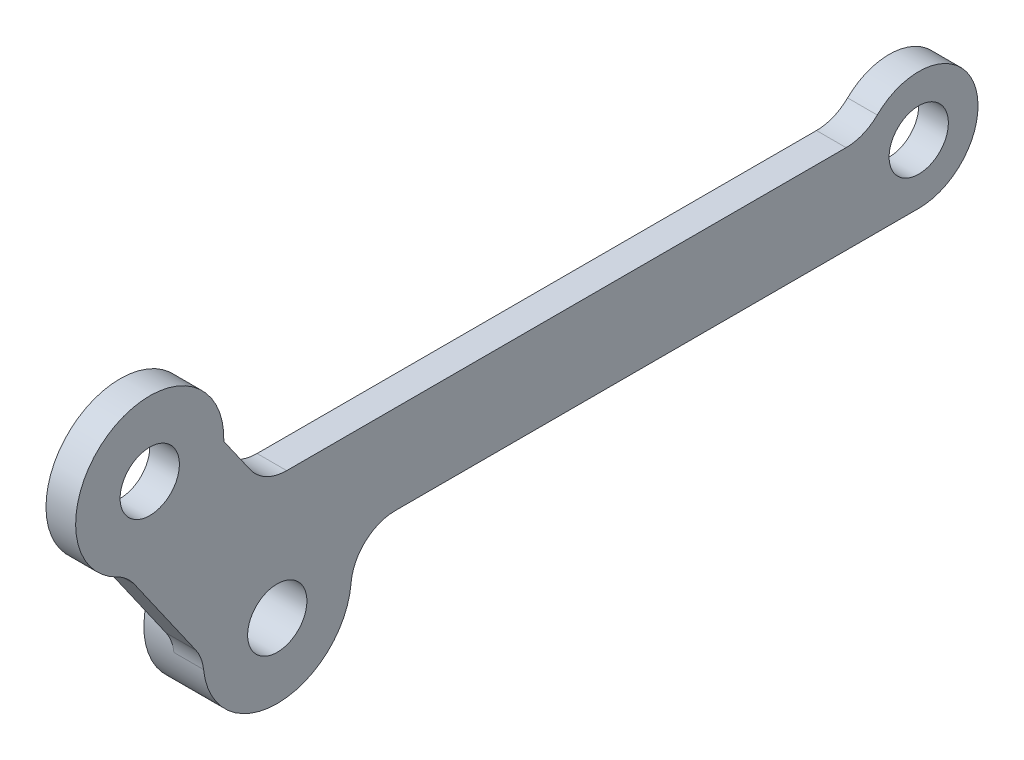
ISO-10303-21;
HEADER;
FILE_DESCRIPTION(('STEP AP214'),'2;1');
FILE_NAME('part.step','',(''),(''),'','','');
FILE_SCHEMA(('AUTOMOTIVE_DESIGN { 1 0 10303 214 1 1 1 1 }'));
ENDSEC;
DATA;
#1=APPLICATION_CONTEXT('core data for automotive mechanical design processes');
#2=APPLICATION_PROTOCOL_DEFINITION('international standard','automotive_design',2000,#1);
#3=PRODUCT_CONTEXT('',#1,'mechanical');
#4=PRODUCT('Part','Part','',(#3));
#5=PRODUCT_RELATED_PRODUCT_CATEGORY('part','',(#4));
#6=PRODUCT_DEFINITION_FORMATION('','',#4);
#7=PRODUCT_DEFINITION_CONTEXT('part definition',#1,'design');
#8=PRODUCT_DEFINITION('design','',#6,#7);
#9=PRODUCT_DEFINITION_SHAPE('','',#8);
#10=(LENGTH_UNIT() NAMED_UNIT(*) SI_UNIT(.MILLI.,.METRE.));
#11=(NAMED_UNIT(*) PLANE_ANGLE_UNIT() SI_UNIT($,.RADIAN.));
#12=(NAMED_UNIT(*) SI_UNIT($,.STERADIAN.) SOLID_ANGLE_UNIT());
#13=UNCERTAINTY_MEASURE_WITH_UNIT(LENGTH_MEASURE(1.E-05),#10,'distance_accuracy_value','');
#14=(GEOMETRIC_REPRESENTATION_CONTEXT(3) GLOBAL_UNCERTAINTY_ASSIGNED_CONTEXT((#13)) GLOBAL_UNIT_ASSIGNED_CONTEXT((#10,
#11,#12)) REPRESENTATION_CONTEXT('',''));
#15=CARTESIAN_POINT('',(0.,0.,0.));
#16=DIRECTION('',(0.,0.,1.));
#17=DIRECTION('',(1.,0.,0.));
#18=AXIS2_PLACEMENT_3D('',#15,#16,#17);
#19=CARTESIAN_POINT('',(2.,0.,0.));
#20=DIRECTION('',(0.,1.,0.));
#21=DIRECTION('',(0.,0.,1.));
#22=AXIS2_PLACEMENT_3D('',#19,#20,#21);
#23=PLANE('',#22);
#24=DIRECTION('',(0.,0.,-1.));
#25=VECTOR('',#24,1.);
#26=CARTESIAN_POINT('',(2.,0.,0.));
#27=LINE('',#26,#25);
#28=CARTESIAN_POINT('',(2.,0.,-1.56170115165524));
#29=VERTEX_POINT('',#28);
#30=CARTESIAN_POINT('',(2.,0.,-39.3022657436919));
#31=VERTEX_POINT('',#30);
#32=EDGE_CURVE('E237',#29,#31,#27,.T.);
#33=ORIENTED_EDGE('',*,*,#32,.T.);
#34=DIRECTION('',(-1.,0.,0.));
#35=VECTOR('',#34,1.);
#36=CARTESIAN_POINT('',(2.,0.,-39.3022657436919));
#37=LINE('',#36,#35);
#38=CARTESIAN_POINT('',(0.,0.,-39.3022657436919));
#39=VERTEX_POINT('',#38);
#40=EDGE_CURVE('E271',#31,#39,#37,.T.);
#41=ORIENTED_EDGE('',*,*,#40,.T.);
#42=DIRECTION('',(0.,0.,-1.));
#43=VECTOR('',#42,1.);
#44=CARTESIAN_POINT('',(0.,0.,0.));
#45=LINE('',#44,#43);
#46=CARTESIAN_POINT('',(0.,0.,-1.56170115165524));
#47=VERTEX_POINT('',#46);
#48=EDGE_CURVE('E267',#47,#39,#45,.T.);
#49=ORIENTED_EDGE('',*,*,#48,.F.);
#50=DIRECTION('',(-1.,0.,0.));
#51=VECTOR('',#50,1.);
#52=CARTESIAN_POINT('',(2.,0.,-1.56170115165524));
#53=LINE('',#52,#51);
#54=EDGE_CURVE('E247',#47,#29,#53,.F.);
#55=ORIENTED_EDGE('',*,*,#54,.T.);
#56=EDGE_LOOP('',(#33,#41,#49,#55));
#57=FACE_BOUND('',#56,.T.);
#58=ADVANCED_FACE('F134',(#57),#23,.T.);
#59=CARTESIAN_POINT('',(2.,-6.,0.));
#60=DIRECTION('',(0.,1.,0.));
#61=DIRECTION('',(0.,0.,1.));
#62=AXIS2_PLACEMENT_3D('',#59,#60,#61);
#63=PLANE('',#62);
#64=DIRECTION('',(0.,0.,-1.));
#65=VECTOR('',#64,1.);
#66=CARTESIAN_POINT('',(2.,-6.,0.));
#67=LINE('',#66,#65);
#68=CARTESIAN_POINT('',(2.,-6.,-8.89345099264765));
#69=VERTEX_POINT('',#68);
#70=CARTESIAN_POINT('',(2.,-6.,-44.2012452292583));
#71=VERTEX_POINT('',#70);
#72=EDGE_CURVE('E223',#69,#71,#67,.T.);
#73=ORIENTED_EDGE('',*,*,#72,.F.);
#74=DIRECTION('',(1.,0.,0.));
#75=VECTOR('',#74,1.);
#76=CARTESIAN_POINT('',(0.,-6.,-8.89345099264765));
#77=LINE('',#76,#75);
#78=CARTESIAN_POINT('',(0.,-6.,-8.89345099264765));
#79=VERTEX_POINT('',#78);
#80=EDGE_CURVE('E294',#69,#79,#77,.F.);
#81=ORIENTED_EDGE('',*,*,#80,.T.);
#82=DIRECTION('',(0.,0.,-1.));
#83=VECTOR('',#82,1.);
#84=CARTESIAN_POINT('',(0.,-6.,0.));
#85=LINE('',#84,#83);
#86=CARTESIAN_POINT('',(0.,-6.,-44.2012452292583));
#87=VERTEX_POINT('',#86);
#88=EDGE_CURVE('E242',#79,#87,#85,.T.);
#89=ORIENTED_EDGE('',*,*,#88,.T.);
#90=DIRECTION('',(-1.,0.,0.));
#91=VECTOR('',#90,1.);
#92=CARTESIAN_POINT('',(2.,-6.,-44.2012452292583));
#93=LINE('',#92,#91);
#94=EDGE_CURVE('E236',#71,#87,#93,.T.);
#95=ORIENTED_EDGE('',*,*,#94,.F.);
#96=EDGE_LOOP('',(#73,#81,#89,#95));
#97=FACE_BOUND('',#96,.T.);
#98=ADVANCED_FACE('F240',(#97),#63,.F.);
#99=CARTESIAN_POINT('',(0.,0.,0.));
#100=DIRECTION('',(1.,0.,0.));
#101=DIRECTION('',(0.,0.,-1.));
#102=AXIS2_PLACEMENT_3D('',#99,#100,#101);
#103=PLANE('',#102);
#104=CARTESIAN_POINT('',(0.,3.99297491893071,7.67900949316339));
#105=DIRECTION('',(1.,0.,0.));
#106=DIRECTION('',(0.,0.,-1.));
#107=AXIS2_PLACEMENT_3D('',#104,#105,#106);
#108=CIRCLE('',#107,2.);
#109=CARTESIAN_POINT('',(0.,3.99297491893071,5.67900949316339));
#110=VERTEX_POINT('',#109);
#111=EDGE_CURVE('E366',#110,#110,#108,.F.);
#112=ORIENTED_EDGE('',*,*,#111,.F.);
#113=EDGE_LOOP('',(#112));
#114=FACE_BOUND('',#113,.T.);
#115=CARTESIAN_POINT('',(0.,-2.,-44.2012452292583));
#116=DIRECTION('',(1.,0.,0.));
#117=DIRECTION('',(0.,0.,-1.));
#118=AXIS2_PLACEMENT_3D('',#115,#116,#117);
#119=CIRCLE('',#118,2.);
#120=CARTESIAN_POINT('',(0.,-2.,-46.2012452292583));
#121=VERTEX_POINT('',#120);
#122=EDGE_CURVE('E373',#121,#121,#119,.F.);
#123=ORIENTED_EDGE('',*,*,#122,.F.);
#124=EDGE_LOOP('',(#123));
#125=FACE_BOUND('',#124,.T.);
#126=ORIENTED_EDGE('',*,*,#88,.F.);
#127=CARTESIAN_POINT('',(0.,-9.,-8.89345099264765));
#128=DIRECTION('',(1.,0.,0.));
#129=DIRECTION('',(0.,0.,-1.));
#130=AXIS2_PLACEMENT_3D('',#127,#128,#129);
#131=CIRCLE('',#130,3.);
#132=CARTESIAN_POINT('',(0.,-8.73536465452657,-5.90514576494314));
#133=VERTEX_POINT('',#132);
#134=EDGE_CURVE('E318',#79,#133,#131,.T.);
#135=ORIENTED_EDGE('',*,*,#134,.T.);
#136=CARTESIAN_POINT('',(0.,-8.29430574540418,-0.924637052102279));
#137=DIRECTION('',(1.,0.,0.));
#138=DIRECTION('',(0.,0.,-1.));
#139=AXIS2_PLACEMENT_3D('',#136,#137,#138);
#140=CIRCLE('',#139,4.99999999999999);
#141=CARTESIAN_POINT('',(0.,-8.82085126347562,4.04756063276493));
#142=VERTEX_POINT('',#141);
#143=EDGE_CURVE('E363',#133,#142,#140,.T.);
#144=ORIENTED_EDGE('',*,*,#143,.T.);
#145=CARTESIAN_POINT('',(0.,-9.13677857431849,7.03087924368525));
#146=DIRECTION('',(1.,0.,0.));
#147=DIRECTION('',(0.,0.,-1.));
#148=AXIS2_PLACEMENT_3D('',#145,#146,#147);
#149=CIRCLE('',#148,3.);
#150=CARTESIAN_POINT('',(0.,-7.41604926526535,4.57342311081828));
#151=VERTEX_POINT('',#150);
#152=EDGE_CURVE('E306',#142,#151,#149,.T.);
#153=ORIENTED_EDGE('',*,*,#152,.T.);
#154=DIRECTION('',(0.,-0.819152044288993,-0.573576436351045));
#155=VECTOR('',#154,1.);
#156=CARTESIAN_POINT('',(0.,1.69866917352653,10.9556176703194));
#157=LINE('',#156,#155);
#158=CARTESIAN_POINT('',(0.,-1.47389305201649,8.73416568455478));
#159=VERTEX_POINT('',#158);
#160=EDGE_CURVE('E343',#159,#151,#157,.T.);
#161=ORIENTED_EDGE('',*,*,#160,.F.);
#162=CARTESIAN_POINT('',(0.,-3.19462236106962,11.1916218174218));
#163=DIRECTION('',(1.,0.,0.));
#164=DIRECTION('',(0.,0.,-1.));
#165=AXIS2_PLACEMENT_3D('',#162,#163,#164);
#166=CIRCLE('',#165,3.);
#167=CARTESIAN_POINT('',(0.,-0.499273381069496,9.87439219582487));
#168=VERTEX_POINT('',#167);
#169=EDGE_CURVE('E312',#159,#168,#166,.T.);
#170=ORIENTED_EDGE('',*,*,#169,.T.);
#171=CARTESIAN_POINT('',(0.,3.99297491893071,7.67900949316339));
#172=DIRECTION('',(1.,0.,0.));
#173=DIRECTION('',(0.,0.,-1.));
#174=AXIS2_PLACEMENT_3D('',#171,#172,#173);
#175=CIRCLE('',#174,4.99999999999999);
#176=CARTESIAN_POINT('',(0.,3.82982453146792,2.6816720069543));
#177=VERTEX_POINT('',#176);
#178=EDGE_CURVE('E348',#177,#168,#175,.T.);
#179=ORIENTED_EDGE('',*,*,#178,.F.);
#180=DIRECTION('',(0.,-0.819152044288992,-0.573576436351045));
#181=VECTOR('',#180,1.);
#182=CARTESIAN_POINT('',(0.,6.28728066433489,4.40240131600742));
#183=LINE('',#182,#181);
#184=CARTESIAN_POINT('',(0.,1.27927069094687,0.895754981211733));
#185=VERTEX_POINT('',#184);
#186=EDGE_CURVE('E258',#177,#185,#183,.T.);
#187=ORIENTED_EDGE('',*,*,#186,.T.);
#188=CARTESIAN_POINT('',(0.,3.,-1.56170115165524));
#189=DIRECTION('',(1.,0.,0.));
#190=DIRECTION('',(0.,0.,-1.));
#191=AXIS2_PLACEMENT_3D('',#188,#189,#190);
#192=CIRCLE('',#191,3.);
#193=EDGE_CURVE('E143',#185,#47,#192,.T.);
#194=ORIENTED_EDGE('',*,*,#193,.T.);
#195=ORIENTED_EDGE('',*,*,#48,.T.);
#196=CARTESIAN_POINT('',(0.,3.,-39.3022657436919));
#197=DIRECTION('',(1.,0.,0.));
#198=DIRECTION('',(0.,0.,-1.));
#199=AXIS2_PLACEMENT_3D('',#196,#197,#198);
#200=CIRCLE('',#199,3.);
#201=CARTESIAN_POINT('',(0.,0.857142857142855,-41.4018283803632));
#202=VERTEX_POINT('',#201);
#203=EDGE_CURVE('E300',#39,#202,#200,.T.);
#204=ORIENTED_EDGE('',*,*,#203,.T.);
#205=CARTESIAN_POINT('',(0.,-2.,-44.2012452292583));
#206=DIRECTION('',(1.,0.,0.));
#207=DIRECTION('',(0.,0.,-1.));
#208=AXIS2_PLACEMENT_3D('',#205,#206,#207);
#209=CIRCLE('',#208,3.99999999999999);
#210=EDGE_CURVE('E254',#87,#202,#209,.T.);
#211=ORIENTED_EDGE('',*,*,#210,.F.);
#212=EDGE_LOOP('',(#126,#135,#144,#153,#161,#170,#179,#187,#194,#195,#204,#211));
#213=FACE_BOUND('',#212,.T.);
#214=ADVANCED_FACE('F328',(#114,#125,#213),#103,.F.);
#215=CARTESIAN_POINT('',(2.,0.,0.));
#216=DIRECTION('',(1.,0.,0.));
#217=DIRECTION('',(0.,0.,-1.));
#218=AXIS2_PLACEMENT_3D('',#215,#216,#217);
#219=PLANE('',#218);
#220=CARTESIAN_POINT('',(2.,3.99297491893071,7.67900949316339));
#221=DIRECTION('',(1.,0.,0.));
#222=DIRECTION('',(0.,0.,-1.));
#223=AXIS2_PLACEMENT_3D('',#220,#221,#222);
#224=CIRCLE('',#223,2.);
#225=CARTESIAN_POINT('',(2.,3.99297491893071,5.67900949316339));
#226=VERTEX_POINT('',#225);
#227=EDGE_CURVE('E377',#226,#226,#224,.T.);
#228=ORIENTED_EDGE('',*,*,#227,.F.);
#229=EDGE_LOOP('',(#228));
#230=FACE_BOUND('',#229,.T.);
#231=CARTESIAN_POINT('',(2.,-8.29430574540418,-0.924637052102279));
#232=DIRECTION('',(1.,0.,0.));
#233=DIRECTION('',(0.,0.,-1.));
#234=AXIS2_PLACEMENT_3D('',#231,#232,#233);
#235=CIRCLE('',#234,2.);
#236=CARTESIAN_POINT('',(2.,-8.29430574540418,-2.92463705210228));
#237=VERTEX_POINT('',#236);
#238=EDGE_CURVE('E382',#237,#237,#235,.T.);
#239=ORIENTED_EDGE('',*,*,#238,.F.);
#240=EDGE_LOOP('',(#239));
#241=FACE_BOUND('',#240,.T.);
#242=CARTESIAN_POINT('',(2.,-2.,-44.2012452292583));
#243=DIRECTION('',(1.,0.,0.));
#244=DIRECTION('',(0.,0.,-1.));
#245=AXIS2_PLACEMENT_3D('',#242,#243,#244);
#246=CIRCLE('',#245,2.);
#247=CARTESIAN_POINT('',(2.,-2.,-46.2012452292583));
#248=VERTEX_POINT('',#247);
#249=EDGE_CURVE('E378',#248,#248,#246,.T.);
#250=ORIENTED_EDGE('',*,*,#249,.F.);
#251=EDGE_LOOP('',(#250));
#252=FACE_BOUND('',#251,.T.);
#253=CARTESIAN_POINT('',(2.,-8.29430574540418,-0.924637052102279));
#254=DIRECTION('',(1.,0.,0.));
#255=DIRECTION('',(0.,0.,-1.));
#256=AXIS2_PLACEMENT_3D('',#253,#254,#255);
#257=CIRCLE('',#256,4.99999999999999);
#258=CARTESIAN_POINT('',(2.,-8.82085126347562,4.04756063276493));
#259=VERTEX_POINT('',#258);
#260=CARTESIAN_POINT('',(2.,-8.73536465452657,-5.90514576494314));
#261=VERTEX_POINT('',#260);
#262=EDGE_CURVE('E253',#259,#261,#257,.T.);
#263=ORIENTED_EDGE('',*,*,#262,.T.);
#264=CARTESIAN_POINT('',(2.,-9.,-8.89345099264765));
#265=DIRECTION('',(1.,0.,0.));
#266=DIRECTION('',(0.,0.,-1.));
#267=AXIS2_PLACEMENT_3D('',#264,#265,#266);
#268=CIRCLE('',#267,3.);
#269=EDGE_CURVE('E231',#261,#69,#268,.F.);
#270=ORIENTED_EDGE('',*,*,#269,.T.);
#271=ORIENTED_EDGE('',*,*,#72,.T.);
#272=CARTESIAN_POINT('',(2.,-2.,-44.2012452292583));
#273=DIRECTION('',(1.,0.,0.));
#274=DIRECTION('',(0.,0.,-1.));
#275=AXIS2_PLACEMENT_3D('',#272,#273,#274);
#276=CIRCLE('',#275,3.99999999999999);
#277=CARTESIAN_POINT('',(2.,0.857142857142855,-41.4018283803632));
#278=VERTEX_POINT('',#277);
#279=EDGE_CURVE('E228',#71,#278,#276,.T.);
#280=ORIENTED_EDGE('',*,*,#279,.T.);
#281=CARTESIAN_POINT('',(2.,3.,-39.3022657436919));
#282=DIRECTION('',(1.,0.,0.));
#283=DIRECTION('',(0.,0.,-1.));
#284=AXIS2_PLACEMENT_3D('',#281,#282,#283);
#285=CIRCLE('',#284,3.);
#286=EDGE_CURVE('E303',#278,#31,#285,.F.);
#287=ORIENTED_EDGE('',*,*,#286,.T.);
#288=ORIENTED_EDGE('',*,*,#32,.F.);
#289=CARTESIAN_POINT('',(2.,3.,-1.56170115165524));
#290=DIRECTION('',(1.,0.,0.));
#291=DIRECTION('',(0.,0.,-1.));
#292=AXIS2_PLACEMENT_3D('',#289,#290,#291);
#293=CIRCLE('',#292,3.);
#294=CARTESIAN_POINT('',(2.,1.27927069094687,0.895754981211733));
#295=VERTEX_POINT('',#294);
#296=EDGE_CURVE('E12',#29,#295,#293,.F.);
#297=ORIENTED_EDGE('',*,*,#296,.T.);
#298=DIRECTION('',(0.,-0.819152044288992,-0.573576436351045));
#299=VECTOR('',#298,1.);
#300=CARTESIAN_POINT('',(2.,6.28728066433489,4.40240131600742));
#301=LINE('',#300,#299);
#302=CARTESIAN_POINT('',(2.,3.82982453146792,2.6816720069543));
#303=VERTEX_POINT('',#302);
#304=EDGE_CURVE('E338',#303,#295,#301,.T.);
#305=ORIENTED_EDGE('',*,*,#304,.F.);
#306=CARTESIAN_POINT('',(2.,3.99297491893071,7.67900949316339));
#307=DIRECTION('',(1.,0.,0.));
#308=DIRECTION('',(0.,0.,-1.));
#309=AXIS2_PLACEMENT_3D('',#306,#307,#308);
#310=CIRCLE('',#309,4.99999999999999);
#311=CARTESIAN_POINT('',(2.,-0.499273381069496,9.87439219582487));
#312=VERTEX_POINT('',#311);
#313=EDGE_CURVE('E268',#303,#312,#310,.T.);
#314=ORIENTED_EDGE('',*,*,#313,.T.);
#315=CARTESIAN_POINT('',(2.,-3.19462236106962,11.1916218174218));
#316=DIRECTION('',(1.,0.,0.));
#317=DIRECTION('',(0.,0.,-1.));
#318=AXIS2_PLACEMENT_3D('',#315,#316,#317);
#319=CIRCLE('',#318,3.);
#320=CARTESIAN_POINT('',(2.,-1.47389305201649,8.73416568455478));
#321=VERTEX_POINT('',#320);
#322=EDGE_CURVE('E315',#312,#321,#319,.F.);
#323=ORIENTED_EDGE('',*,*,#322,.T.);
#324=DIRECTION('',(0.,-0.819152044288993,-0.573576436351045));
#325=VECTOR('',#324,1.);
#326=CARTESIAN_POINT('',(2.,1.69866917352653,10.9556176703194));
#327=LINE('',#326,#325);
#328=CARTESIAN_POINT('',(2.,-7.41604926526535,4.57342311081828));
#329=VERTEX_POINT('',#328);
#330=EDGE_CURVE('E342',#321,#329,#327,.T.);
#331=ORIENTED_EDGE('',*,*,#330,.T.);
#332=CARTESIAN_POINT('',(2.,-9.13677857431849,7.03087924368525));
#333=DIRECTION('',(1.,0.,0.));
#334=DIRECTION('',(0.,0.,-1.));
#335=AXIS2_PLACEMENT_3D('',#332,#333,#334);
#336=CIRCLE('',#335,3.);
#337=EDGE_CURVE('E309',#329,#259,#336,.F.);
#338=ORIENTED_EDGE('',*,*,#337,.T.);
#339=EDGE_LOOP('',(#263,#270,#271,#280,#287,#288,#297,#305,#314,#323,#331,#338));
#340=FACE_BOUND('',#339,.T.);
#341=ADVANCED_FACE('F226',(#230,#241,#252,#340),#219,.T.);
#342=CARTESIAN_POINT('',(2.,-2.,-44.2012452292583));
#343=DIRECTION('',(-1.,0.,0.));
#344=DIRECTION('',(0.,0.,1.));
#345=AXIS2_PLACEMENT_3D('',#342,#343,#344);
#346=CYLINDRICAL_SURFACE('',#345,3.99999999999999);
#347=ORIENTED_EDGE('',*,*,#210,.T.);
#348=DIRECTION('',(-1.,0.,0.));
#349=VECTOR('',#348,1.);
#350=CARTESIAN_POINT('',(2.,0.857142857142855,-41.4018283803632));
#351=LINE('',#350,#349);
#352=EDGE_CURVE('E251',#202,#278,#351,.F.);
#353=ORIENTED_EDGE('',*,*,#352,.T.);
#354=ORIENTED_EDGE('',*,*,#279,.F.);
#355=ORIENTED_EDGE('',*,*,#94,.T.);
#356=EDGE_LOOP('',(#347,#353,#354,#355));
#357=FACE_BOUND('',#356,.T.);
#358=ADVANCED_FACE('F249',(#357),#346,.T.);
#359=CARTESIAN_POINT('',(2.,3.99297491893071,7.67900949316339));
#360=DIRECTION('',(-1.,0.,0.));
#361=DIRECTION('',(0.,0.,1.));
#362=AXIS2_PLACEMENT_3D('',#359,#360,#361);
#363=CYLINDRICAL_SURFACE('',#362,4.99999999999999);
#364=ORIENTED_EDGE('',*,*,#178,.T.);
#365=DIRECTION('',(-1.,0.,0.));
#366=VECTOR('',#365,1.);
#367=CARTESIAN_POINT('',(2.,-0.499273381069497,9.87439219582487));
#368=LINE('',#367,#366);
#369=EDGE_CURVE('E291',#168,#312,#368,.F.);
#370=ORIENTED_EDGE('',*,*,#369,.T.);
#371=ORIENTED_EDGE('',*,*,#313,.F.);
#372=DIRECTION('',(-1.,0.,0.));
#373=VECTOR('',#372,1.);
#374=CARTESIAN_POINT('',(2.,3.82982453146792,2.6816720069543));
#375=LINE('',#374,#373);
#376=EDGE_CURVE('E264',#303,#177,#375,.T.);
#377=ORIENTED_EDGE('',*,*,#376,.T.);
#378=EDGE_LOOP('',(#364,#370,#371,#377));
#379=FACE_BOUND('',#378,.T.);
#380=ADVANCED_FACE('F424',(#379),#363,.T.);
#381=CARTESIAN_POINT('',(2.,6.28728066433489,4.40240131600742));
#382=DIRECTION('',(0.,0.573576436351045,-0.819152044288992));
#383=DIRECTION('',(0.,0.819152044288993,0.573576436351045));
#384=AXIS2_PLACEMENT_3D('',#381,#382,#383);
#385=PLANE('',#384);
#386=ORIENTED_EDGE('',*,*,#304,.T.);
#387=DIRECTION('',(-1.,0.,0.));
#388=VECTOR('',#387,1.);
#389=CARTESIAN_POINT('',(0.,1.27927069094686,0.895754981211733));
#390=LINE('',#389,#388);
#391=EDGE_CURVE('E297',#295,#185,#390,.T.);
#392=ORIENTED_EDGE('',*,*,#391,.T.);
#393=ORIENTED_EDGE('',*,*,#186,.F.);
#394=ORIENTED_EDGE('',*,*,#376,.F.);
#395=EDGE_LOOP('',(#386,#392,#393,#394));
#396=FACE_BOUND('',#395,.T.);
#397=ADVANCED_FACE('F337',(#396),#385,.T.);
#398=CARTESIAN_POINT('',(2.,1.69866917352653,10.9556176703194));
#399=DIRECTION('',(0.,0.573576436351045,-0.819152044288993));
#400=DIRECTION('',(0.,0.819152044288993,0.573576436351045));
#401=AXIS2_PLACEMENT_3D('',#398,#399,#400);
#402=PLANE('',#401);
#403=ORIENTED_EDGE('',*,*,#160,.T.);
#404=DIRECTION('',(1.,0.,0.));
#405=VECTOR('',#404,1.);
#406=CARTESIAN_POINT('',(2.,-7.41604926526535,4.57342311081828));
#407=LINE('',#406,#405);
#408=EDGE_CURVE('E288',#151,#329,#407,.T.);
#409=ORIENTED_EDGE('',*,*,#408,.T.);
#410=ORIENTED_EDGE('',*,*,#330,.F.);
#411=DIRECTION('',(1.,0.,0.));
#412=VECTOR('',#411,1.);
#413=CARTESIAN_POINT('',(0.,-1.47389305201649,8.73416568455478));
#414=LINE('',#413,#412);
#415=EDGE_CURVE('E284',#321,#159,#414,.F.);
#416=ORIENTED_EDGE('',*,*,#415,.T.);
#417=EDGE_LOOP('',(#403,#409,#410,#416));
#418=FACE_BOUND('',#417,.T.);
#419=ADVANCED_FACE('F428',(#418),#402,.F.);
#420=CARTESIAN_POINT('',(2.,-8.29430574540418,-0.924637052102279));
#421=DIRECTION('',(-1.,0.,0.));
#422=DIRECTION('',(0.,0.,1.));
#423=AXIS2_PLACEMENT_3D('',#420,#421,#422);
#424=CYLINDRICAL_SURFACE('',#423,4.99999999999999);
#425=ORIENTED_EDGE('',*,*,#262,.F.);
#426=DIRECTION('',(-1.,0.,0.));
#427=VECTOR('',#426,1.);
#428=CARTESIAN_POINT('',(2.,-8.82085126347562,4.04756063276493));
#429=LINE('',#428,#427);
#430=EDGE_CURVE('E280',#259,#142,#429,.T.);
#431=ORIENTED_EDGE('',*,*,#430,.T.);
#432=ORIENTED_EDGE('',*,*,#143,.F.);
#433=DIRECTION('',(-1.,0.,0.));
#434=VECTOR('',#433,1.);
#435=CARTESIAN_POINT('',(2.,-8.73536465452657,-5.90514576494314));
#436=LINE('',#435,#434);
#437=EDGE_CURVE('E277',#133,#261,#436,.F.);
#438=ORIENTED_EDGE('',*,*,#437,.T.);
#439=EDGE_LOOP('',(#425,#431,#432,#438));
#440=FACE_BOUND('',#439,.T.);
#441=CARTESIAN_POINT('',(-2.,-8.29430574540418,-0.924637052102279));
#442=DIRECTION('',(1.,0.,0.));
#443=DIRECTION('',(0.,0.,-1.));
#444=AXIS2_PLACEMENT_3D('',#441,#442,#443);
#445=CIRCLE('',#444,4.99999999999999);
#446=CARTESIAN_POINT('',(-2.,-8.29430574540418,-5.92463705210227));
#447=VERTEX_POINT('',#446);
#448=EDGE_CURVE('E260',#447,#447,#445,.T.);
#449=ORIENTED_EDGE('',*,*,#448,.T.);
#450=EDGE_LOOP('',(#449));
#451=FACE_BOUND('',#450,.T.);
#452=ADVANCED_FACE('F431',(#440,#451),#424,.T.);
#453=CARTESIAN_POINT('',(-2.,-8.29430574540418,-0.924637052102279));
#454=DIRECTION('',(1.,0.,0.));
#455=DIRECTION('',(0.,0.,-1.));
#456=AXIS2_PLACEMENT_3D('',#453,#454,#455);
#457=PLANE('',#456);
#458=CARTESIAN_POINT('',(-2.,-8.29430574540418,-0.924637052102279));
#459=DIRECTION('',(1.,0.,0.));
#460=DIRECTION('',(0.,0.,-1.));
#461=AXIS2_PLACEMENT_3D('',#458,#459,#460);
#462=CIRCLE('',#461,2.);
#463=CARTESIAN_POINT('',(-2.,-8.29430574540418,-2.92463705210228));
#464=VERTEX_POINT('',#463);
#465=EDGE_CURVE('E383',#464,#464,#462,.T.);
#466=ORIENTED_EDGE('',*,*,#465,.T.);
#467=EDGE_LOOP('',(#466));
#468=FACE_BOUND('',#467,.T.);
#469=ORIENTED_EDGE('',*,*,#448,.F.);
#470=EDGE_LOOP('',(#469));
#471=FACE_BOUND('',#470,.T.);
#472=ADVANCED_FACE('F437',(#468,#471),#457,.F.);
#473=CARTESIAN_POINT('',(2.,-8.29430574540418,-0.924637052102279));
#474=DIRECTION('',(-1.,0.,0.));
#475=DIRECTION('',(0.,0.,1.));
#476=AXIS2_PLACEMENT_3D('',#473,#474,#475);
#477=CYLINDRICAL_SURFACE('',#476,2.);
#478=ORIENTED_EDGE('',*,*,#238,.T.);
#479=EDGE_LOOP('',(#478));
#480=FACE_BOUND('',#479,.T.);
#481=ORIENTED_EDGE('',*,*,#465,.F.);
#482=EDGE_LOOP('',(#481));
#483=FACE_BOUND('',#482,.T.);
#484=ADVANCED_FACE('F407',(#480,#483),#477,.F.);
#485=CARTESIAN_POINT('',(2.,-2.,-44.2012452292583));
#486=DIRECTION('',(-1.,0.,0.));
#487=DIRECTION('',(0.,0.,1.));
#488=AXIS2_PLACEMENT_3D('',#485,#486,#487);
#489=CYLINDRICAL_SURFACE('',#488,2.);
#490=ORIENTED_EDGE('',*,*,#249,.T.);
#491=EDGE_LOOP('',(#490));
#492=FACE_BOUND('',#491,.T.);
#493=ORIENTED_EDGE('',*,*,#122,.T.);
#494=EDGE_LOOP('',(#493));
#495=FACE_BOUND('',#494,.T.);
#496=ADVANCED_FACE('F404',(#492,#495),#489,.F.);
#497=CARTESIAN_POINT('',(2.,3.99297491893071,7.67900949316339));
#498=DIRECTION('',(-1.,0.,0.));
#499=DIRECTION('',(0.,0.,1.));
#500=AXIS2_PLACEMENT_3D('',#497,#498,#499);
#501=CYLINDRICAL_SURFACE('',#500,2.);
#502=ORIENTED_EDGE('',*,*,#227,.T.);
#503=EDGE_LOOP('',(#502));
#504=FACE_BOUND('',#503,.T.);
#505=ORIENTED_EDGE('',*,*,#111,.T.);
#506=EDGE_LOOP('',(#505));
#507=FACE_BOUND('',#506,.T.);
#508=ADVANCED_FACE('F394',(#504,#507),#501,.F.);
#509=CARTESIAN_POINT('',(2.,3.,-39.3022657436919));
#510=DIRECTION('',(-1.,0.,0.));
#511=DIRECTION('',(0.,0.,1.));
#512=AXIS2_PLACEMENT_3D('',#509,#510,#511);
#513=CYLINDRICAL_SURFACE('',#512,3.);
#514=ORIENTED_EDGE('',*,*,#286,.F.);
#515=ORIENTED_EDGE('',*,*,#352,.F.);
#516=ORIENTED_EDGE('',*,*,#203,.F.);
#517=ORIENTED_EDGE('',*,*,#40,.F.);
#518=EDGE_LOOP('',(#514,#515,#516,#517));
#519=FACE_BOUND('',#518,.T.);
#520=ADVANCED_FACE('F441',(#519),#513,.F.);
#521=CARTESIAN_POINT('',(2.,-9.13677857431849,7.03087924368525));
#522=DIRECTION('',(-1.,0.,0.));
#523=DIRECTION('',(0.,0.,1.));
#524=AXIS2_PLACEMENT_3D('',#521,#522,#523);
#525=CYLINDRICAL_SURFACE('',#524,3.);
#526=ORIENTED_EDGE('',*,*,#337,.F.);
#527=ORIENTED_EDGE('',*,*,#408,.F.);
#528=ORIENTED_EDGE('',*,*,#152,.F.);
#529=ORIENTED_EDGE('',*,*,#430,.F.);
#530=EDGE_LOOP('',(#526,#527,#528,#529));
#531=FACE_BOUND('',#530,.T.);
#532=ADVANCED_FACE('F444',(#531),#525,.F.);
#533=CARTESIAN_POINT('',(2.,-3.19462236106962,11.1916218174218));
#534=DIRECTION('',(-1.,0.,0.));
#535=DIRECTION('',(0.,0.,1.));
#536=AXIS2_PLACEMENT_3D('',#533,#534,#535);
#537=CYLINDRICAL_SURFACE('',#536,3.);
#538=ORIENTED_EDGE('',*,*,#322,.F.);
#539=ORIENTED_EDGE('',*,*,#369,.F.);
#540=ORIENTED_EDGE('',*,*,#169,.F.);
#541=ORIENTED_EDGE('',*,*,#415,.F.);
#542=EDGE_LOOP('',(#538,#539,#540,#541));
#543=FACE_BOUND('',#542,.T.);
#544=ADVANCED_FACE('F448',(#543),#537,.F.);
#545=CARTESIAN_POINT('',(2.,-9.,-8.89345099264765));
#546=DIRECTION('',(-1.,0.,0.));
#547=DIRECTION('',(0.,0.,1.));
#548=AXIS2_PLACEMENT_3D('',#545,#546,#547);
#549=CYLINDRICAL_SURFACE('',#548,3.);
#550=ORIENTED_EDGE('',*,*,#269,.F.);
#551=ORIENTED_EDGE('',*,*,#437,.F.);
#552=ORIENTED_EDGE('',*,*,#134,.F.);
#553=ORIENTED_EDGE('',*,*,#80,.F.);
#554=EDGE_LOOP('',(#550,#551,#552,#553));
#555=FACE_BOUND('',#554,.T.);
#556=ADVANCED_FACE('F451',(#555),#549,.F.);
#557=CARTESIAN_POINT('',(2.,3.,-1.56170115165524));
#558=DIRECTION('',(1.,0.,0.));
#559=DIRECTION('',(0.,0.,-1.));
#560=AXIS2_PLACEMENT_3D('',#557,#558,#559);
#561=CYLINDRICAL_SURFACE('',#560,3.);
#562=ORIENTED_EDGE('',*,*,#296,.F.);
#563=ORIENTED_EDGE('',*,*,#54,.F.);
#564=ORIENTED_EDGE('',*,*,#193,.F.);
#565=ORIENTED_EDGE('',*,*,#391,.F.);
#566=EDGE_LOOP('',(#562,#563,#564,#565));
#567=FACE_BOUND('',#566,.T.);
#568=ADVANCED_FACE('F136',(#567),#561,.F.);
#569=CLOSED_SHELL('',(#58,#98,#214,#341,#358,#380,#397,#419,#452,#472,#484,#496,#508,#520,#532,
#544,#556,#568));
#570=MANIFOLD_SOLID_BREP('B2',#569);
#571=ADVANCED_BREP_SHAPE_REPRESENTATION('',(#18,#570),#14);
#572=SHAPE_DEFINITION_REPRESENTATION(#9,#571);
ENDSEC;
END-ISO-10303-21;
